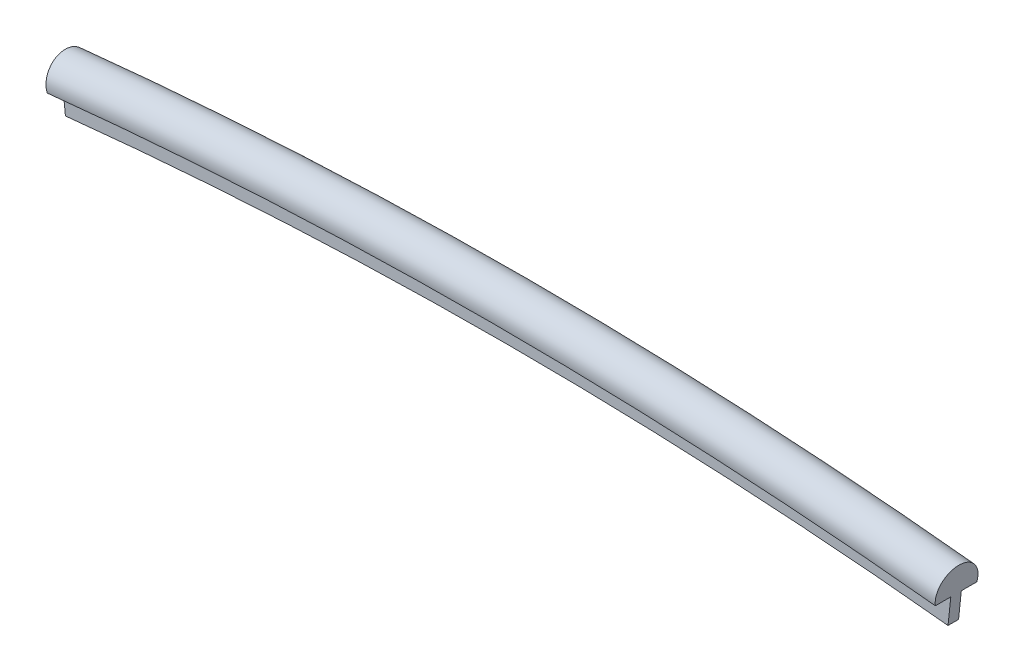
ISO-10303-21;
HEADER;
FILE_DESCRIPTION(('STEP AP214'),'2;1');
FILE_NAME('part.step','',(''),(''),'','','');
FILE_SCHEMA(('AUTOMOTIVE_DESIGN { 1 0 10303 214 1 1 1 1 }'));
ENDSEC;
DATA;
#1=APPLICATION_CONTEXT('core data for automotive mechanical design processes');
#2=APPLICATION_PROTOCOL_DEFINITION('international standard','automotive_design',2000,#1);
#3=PRODUCT_CONTEXT('',#1,'mechanical');
#4=PRODUCT('Part','Part','',(#3));
#5=PRODUCT_RELATED_PRODUCT_CATEGORY('part','',(#4));
#6=PRODUCT_DEFINITION_FORMATION('','',#4);
#7=PRODUCT_DEFINITION_CONTEXT('part definition',#1,'design');
#8=PRODUCT_DEFINITION('design','',#6,#7);
#9=PRODUCT_DEFINITION_SHAPE('','',#8);
#10=(LENGTH_UNIT() NAMED_UNIT(*) SI_UNIT(.MILLI.,.METRE.));
#11=(NAMED_UNIT(*) PLANE_ANGLE_UNIT() SI_UNIT($,.RADIAN.));
#12=(NAMED_UNIT(*) SI_UNIT($,.STERADIAN.) SOLID_ANGLE_UNIT());
#13=UNCERTAINTY_MEASURE_WITH_UNIT(LENGTH_MEASURE(1.E-05),#10,'distance_accuracy_value','');
#14=(GEOMETRIC_REPRESENTATION_CONTEXT(3) GLOBAL_UNCERTAINTY_ASSIGNED_CONTEXT((#13)) GLOBAL_UNIT_ASSIGNED_CONTEXT((#10,
#11,#12)) REPRESENTATION_CONTEXT('',''));
#15=CARTESIAN_POINT('',(0.,0.,0.));
#16=DIRECTION('',(0.,0.,1.));
#17=DIRECTION('',(1.,0.,0.));
#18=AXIS2_PLACEMENT_3D('',#15,#16,#17);
#19=CARTESIAN_POINT('',(0.,0.,70.5976415970385));
#20=DIRECTION('',(0.,0.,1.));
#21=DIRECTION('',(1.,0.,0.));
#22=AXIS2_PLACEMENT_3D('',#19,#20,#21);
#23=CYLINDRICAL_SURFACE('',#22,241.3);
#24=CARTESIAN_POINT('',(0.,0.,1.18));
#25=DIRECTION('',(0.,0.,1.));
#26=DIRECTION('',(1.,0.,0.));
#27=AXIS2_PLACEMENT_3D('',#24,#25,#26);
#28=CIRCLE('',#27,241.3);
#29=CARTESIAN_POINT('',(25.2984442985699,239.970162137029,1.18));
#30=VERTEX_POINT('',#29);
#31=CARTESIAN_POINT('',(-25.29844429857,239.970162137029,1.18));
#32=VERTEX_POINT('',#31);
#33=EDGE_CURVE('E11',#30,#32,#28,.T.);
#34=ORIENTED_EDGE('',*,*,#33,.T.);
#35=DIRECTION('',(0.,0.,-1.));
#36=VECTOR('',#35,1.);
#37=CARTESIAN_POINT('',(-25.29844429857,239.970162137029,1.18));
#38=LINE('',#37,#36);
#39=CARTESIAN_POINT('',(-25.29844429857,239.970162137029,0.3));
#40=VERTEX_POINT('',#39);
#41=EDGE_CURVE('E103',#32,#40,#38,.T.);
#42=ORIENTED_EDGE('',*,*,#41,.T.);
#43=CARTESIAN_POINT('',(0.,0.,0.299999999999995));
#44=DIRECTION('',(0.,0.,1.));
#45=DIRECTION('',(1.,0.,0.));
#46=AXIS2_PLACEMENT_3D('',#43,#44,#45);
#47=CIRCLE('',#46,241.3);
#48=CARTESIAN_POINT('',(25.2984442985699,239.970162137029,0.3));
#49=VERTEX_POINT('',#48);
#50=EDGE_CURVE('E85',#49,#40,#47,.T.);
#51=ORIENTED_EDGE('',*,*,#50,.F.);
#52=DIRECTION('',(0.,0.,-1.));
#53=VECTOR('',#52,1.);
#54=CARTESIAN_POINT('',(25.2984442985699,239.970162137029,1.18));
#55=LINE('',#54,#53);
#56=EDGE_CURVE('E117',#30,#49,#55,.T.);
#57=ORIENTED_EDGE('',*,*,#56,.F.);
#58=EDGE_LOOP('',(#34,#42,#51,#57));
#59=FACE_BOUND('',#58,.T.);
#60=ADVANCED_FACE('F33',(#59),#23,.F.);
#61=CARTESIAN_POINT('',(0.,0.,0.));
#62=DIRECTION('',(0.,0.,1.));
#63=DIRECTION('',(1.,0.,0.));
#64=AXIS2_PLACEMENT_3D('',#61,#62,#63);
#65=TOROIDAL_SURFACE('',#64,241.586013989906,1.21416802890791);
#66=CARTESIAN_POINT('',(0.,0.,-1.18));
#67=DIRECTION('',(0.,0.,1.));
#68=DIRECTION('',(1.,0.,0.));
#69=AXIS2_PLACEMENT_3D('',#66,#67,#68);
#70=CIRCLE('',#69,241.3);
#71=CARTESIAN_POINT('',(25.2984442985699,239.970162137029,-1.18));
#72=VERTEX_POINT('',#71);
#73=CARTESIAN_POINT('',(-25.29844429857,239.970162137029,-1.18));
#74=VERTEX_POINT('',#73);
#75=EDGE_CURVE('E41',#72,#74,#70,.T.);
#76=ORIENTED_EDGE('',*,*,#75,.T.);
#77=CARTESIAN_POINT('',(-25.3284306599137,240.254599864055,0.));
#78=DIRECTION('',(0.994488860907705,0.104842288846125,0.));
#79=DIRECTION('',(0.,0.,1.));
#80=AXIS2_PLACEMENT_3D('',#77,#78,#79);
#81=CIRCLE('',#80,1.21416802890791);
#82=EDGE_CURVE('E115',#74,#32,#81,.T.);
#83=ORIENTED_EDGE('',*,*,#82,.T.);
#84=ORIENTED_EDGE('',*,*,#33,.F.);
#85=CARTESIAN_POINT('',(25.3284306599137,240.254599864055,0.));
#86=DIRECTION('',(0.994488860907705,-0.104842288846125,0.));
#87=DIRECTION('',(0.,0.,1.));
#88=AXIS2_PLACEMENT_3D('',#85,#86,#87);
#89=CIRCLE('',#88,1.21416802890791);
#90=EDGE_CURVE('E97',#72,#30,#89,.T.);
#91=ORIENTED_EDGE('',*,*,#90,.F.);
#92=EDGE_LOOP('',(#76,#83,#84,#91));
#93=FACE_BOUND('',#92,.T.);
#94=ADVANCED_FACE('F35',(#93),#65,.T.);
#95=CARTESIAN_POINT('',(0.,0.,70.5976415970385));
#96=DIRECTION('',(0.,0.,1.));
#97=DIRECTION('',(1.,0.,0.));
#98=AXIS2_PLACEMENT_3D('',#95,#96,#97);
#99=CYLINDRICAL_SURFACE('',#98,241.3);
#100=CARTESIAN_POINT('',(0.,0.,-0.299999999999995));
#101=DIRECTION('',(0.,0.,1.));
#102=DIRECTION('',(1.,0.,0.));
#103=AXIS2_PLACEMENT_3D('',#100,#101,#102);
#104=CIRCLE('',#103,241.3);
#105=CARTESIAN_POINT('',(25.2984442985699,239.970162137029,-0.3));
#106=VERTEX_POINT('',#105);
#107=CARTESIAN_POINT('',(-25.29844429857,239.970162137029,-0.3));
#108=VERTEX_POINT('',#107);
#109=EDGE_CURVE('E132',#106,#108,#104,.T.);
#110=ORIENTED_EDGE('',*,*,#109,.T.);
#111=DIRECTION('',(0.,0.,-1.));
#112=VECTOR('',#111,1.);
#113=CARTESIAN_POINT('',(-25.29844429857,239.970162137029,-0.3));
#114=LINE('',#113,#112);
#115=EDGE_CURVE('E113',#108,#74,#114,.T.);
#116=ORIENTED_EDGE('',*,*,#115,.T.);
#117=ORIENTED_EDGE('',*,*,#75,.F.);
#118=DIRECTION('',(0.,0.,-1.));
#119=VECTOR('',#118,1.);
#120=CARTESIAN_POINT('',(25.2984442985699,239.970162137029,-0.3));
#121=LINE('',#120,#119);
#122=EDGE_CURVE('E125',#106,#72,#121,.T.);
#123=ORIENTED_EDGE('',*,*,#122,.F.);
#124=EDGE_LOOP('',(#110,#116,#117,#123));
#125=FACE_BOUND('',#124,.T.);
#126=ADVANCED_FACE('F134',(#125),#99,.F.);
#127=CARTESIAN_POINT('',(25.1411808653008,238.478428845668,-0.3));
#128=DIRECTION('',(0.,0.,1.));
#129=DIRECTION('',(1.,0.,0.));
#130=AXIS2_PLACEMENT_3D('',#127,#128,#129);
#131=PLANE('',#130);
#132=CARTESIAN_POINT('',(0.,0.,-0.299999999999995));
#133=DIRECTION('',(0.,0.,1.));
#134=DIRECTION('',(1.,0.,0.));
#135=AXIS2_PLACEMENT_3D('',#132,#133,#134);
#136=CIRCLE('',#135,239.8);
#137=CARTESIAN_POINT('',(25.1411808653008,238.478428845668,-0.3));
#138=VERTEX_POINT('',#137);
#139=CARTESIAN_POINT('',(-25.1411808653008,238.478428845668,-0.3));
#140=VERTEX_POINT('',#139);
#141=EDGE_CURVE('E129',#138,#140,#136,.T.);
#142=ORIENTED_EDGE('',*,*,#141,.T.);
#143=DIRECTION('',(-0.104842288846125,0.994488860907705,0.));
#144=VECTOR('',#143,1.);
#145=CARTESIAN_POINT('',(-25.1411808653008,238.478428845668,-0.3));
#146=LINE('',#145,#144);
#147=EDGE_CURVE('E110',#140,#108,#146,.T.);
#148=ORIENTED_EDGE('',*,*,#147,.T.);
#149=ORIENTED_EDGE('',*,*,#109,.F.);
#150=DIRECTION('',(0.104842288846125,0.994488860907705,0.));
#151=VECTOR('',#150,1.);
#152=CARTESIAN_POINT('',(25.1411808653008,238.478428845668,-0.3));
#153=LINE('',#152,#151);
#154=EDGE_CURVE('E122',#138,#106,#153,.T.);
#155=ORIENTED_EDGE('',*,*,#154,.F.);
#156=EDGE_LOOP('',(#142,#148,#149,#155));
#157=FACE_BOUND('',#156,.T.);
#158=ADVANCED_FACE('F136',(#157),#131,.F.);
#159=CARTESIAN_POINT('',(0.,0.,70.5976415970385));
#160=DIRECTION('',(0.,0.,1.));
#161=DIRECTION('',(1.,0.,0.));
#162=AXIS2_PLACEMENT_3D('',#159,#160,#161);
#163=CYLINDRICAL_SURFACE('',#162,239.8);
#164=CARTESIAN_POINT('',(0.,0.,0.299999999999995));
#165=DIRECTION('',(0.,0.,1.));
#166=DIRECTION('',(1.,0.,0.));
#167=AXIS2_PLACEMENT_3D('',#164,#165,#166);
#168=CIRCLE('',#167,239.8);
#169=CARTESIAN_POINT('',(25.1411808653008,238.478428845668,0.3));
#170=VERTEX_POINT('',#169);
#171=CARTESIAN_POINT('',(-25.1411808653008,238.478428845668,0.3));
#172=VERTEX_POINT('',#171);
#173=EDGE_CURVE('E96',#170,#172,#168,.T.);
#174=ORIENTED_EDGE('',*,*,#173,.T.);
#175=DIRECTION('',(0.,0.,-1.));
#176=VECTOR('',#175,1.);
#177=CARTESIAN_POINT('',(-25.1411808653008,238.478428845668,0.));
#178=LINE('',#177,#176);
#179=EDGE_CURVE('E105',#172,#140,#178,.T.);
#180=ORIENTED_EDGE('',*,*,#179,.T.);
#181=ORIENTED_EDGE('',*,*,#141,.F.);
#182=DIRECTION('',(0.,0.,-1.));
#183=VECTOR('',#182,1.);
#184=CARTESIAN_POINT('',(25.1411808653008,238.478428845668,0.));
#185=LINE('',#184,#183);
#186=EDGE_CURVE('E120',#170,#138,#185,.T.);
#187=ORIENTED_EDGE('',*,*,#186,.F.);
#188=EDGE_LOOP('',(#174,#180,#181,#187));
#189=FACE_BOUND('',#188,.T.);
#190=ADVANCED_FACE('F141',(#189),#163,.F.);
#191=CARTESIAN_POINT('',(25.1411808653008,238.478428845668,0.3));
#192=DIRECTION('',(0.,0.,-1.));
#193=DIRECTION('',(-1.,0.,0.));
#194=AXIS2_PLACEMENT_3D('',#191,#192,#193);
#195=PLANE('',#194);
#196=DIRECTION('',(-0.104842288846125,-0.994488860907705,0.));
#197=VECTOR('',#196,1.);
#198=CARTESIAN_POINT('',(25.1411808653008,238.478428845668,0.3));
#199=LINE('',#198,#197);
#200=EDGE_CURVE('E91',#49,#170,#199,.T.);
#201=ORIENTED_EDGE('',*,*,#200,.F.);
#202=ORIENTED_EDGE('',*,*,#50,.T.);
#203=DIRECTION('',(0.104842288846125,-0.994488860907705,0.));
#204=VECTOR('',#203,1.);
#205=CARTESIAN_POINT('',(-25.1411808653008,238.478428845668,0.3));
#206=LINE('',#205,#204);
#207=EDGE_CURVE('E88',#40,#172,#206,.T.);
#208=ORIENTED_EDGE('',*,*,#207,.T.);
#209=ORIENTED_EDGE('',*,*,#173,.F.);
#210=EDGE_LOOP('',(#201,#202,#208,#209));
#211=FACE_BOUND('',#210,.T.);
#212=ADVANCED_FACE('F87',(#211),#195,.F.);
#213=CARTESIAN_POINT('',(25.3284306599137,240.254599864055,0.));
#214=DIRECTION('',(-0.994488860907705,0.104842288846125,0.));
#215=DIRECTION('',(0.,0.,1.));
#216=AXIS2_PLACEMENT_3D('',#213,#214,#215);
#217=PLANE('',#216);
#218=ORIENTED_EDGE('',*,*,#56,.T.);
#219=ORIENTED_EDGE('',*,*,#200,.T.);
#220=ORIENTED_EDGE('',*,*,#186,.T.);
#221=ORIENTED_EDGE('',*,*,#154,.T.);
#222=ORIENTED_EDGE('',*,*,#122,.T.);
#223=ORIENTED_EDGE('',*,*,#90,.T.);
#224=EDGE_LOOP('',(#218,#219,#220,#221,#222,#223));
#225=FACE_BOUND('',#224,.T.);
#226=ADVANCED_FACE('F143',(#225),#217,.F.);
#227=CARTESIAN_POINT('',(-25.3284306599137,240.254599864055,0.));
#228=DIRECTION('',(-0.994488860907705,-0.104842288846125,0.));
#229=DIRECTION('',(0.,0.,1.));
#230=AXIS2_PLACEMENT_3D('',#227,#228,#229);
#231=PLANE('',#230);
#232=ORIENTED_EDGE('',*,*,#41,.F.);
#233=ORIENTED_EDGE('',*,*,#82,.F.);
#234=ORIENTED_EDGE('',*,*,#115,.F.);
#235=ORIENTED_EDGE('',*,*,#147,.F.);
#236=ORIENTED_EDGE('',*,*,#179,.F.);
#237=ORIENTED_EDGE('',*,*,#207,.F.);
#238=EDGE_LOOP('',(#232,#233,#234,#235,#236,#237));
#239=FACE_BOUND('',#238,.T.);
#240=ADVANCED_FACE('F101',(#239),#231,.T.);
#241=CLOSED_SHELL('',(#60,#94,#126,#158,#190,#212,#226,#240));
#242=MANIFOLD_SOLID_BREP('B2',#241);
#243=ADVANCED_BREP_SHAPE_REPRESENTATION('',(#18,#242),#14);
#244=SHAPE_DEFINITION_REPRESENTATION(#9,#243);
ENDSEC;
END-ISO-10303-21;
